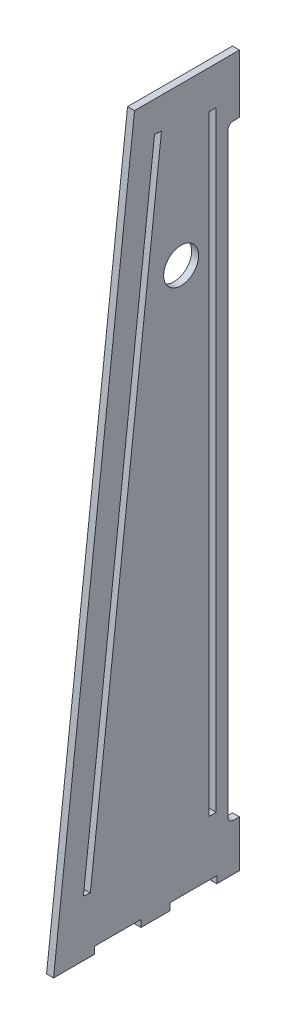
ISO-10303-21;
HEADER;
FILE_DESCRIPTION(('STEP AP214'),'2;1');
FILE_NAME('part.step','',(''),(''),'','','');
FILE_SCHEMA(('AUTOMOTIVE_DESIGN { 1 0 10303 214 1 1 1 1 }'));
ENDSEC;
DATA;
#1=APPLICATION_CONTEXT('core data for automotive mechanical design processes');
#2=APPLICATION_PROTOCOL_DEFINITION('international standard','automotive_design',2000,#1);
#3=PRODUCT_CONTEXT('',#1,'mechanical');
#4=PRODUCT('Part','Part','',(#3));
#5=PRODUCT_RELATED_PRODUCT_CATEGORY('part','',(#4));
#6=PRODUCT_DEFINITION_FORMATION('','',#4);
#7=PRODUCT_DEFINITION_CONTEXT('part definition',#1,'design');
#8=PRODUCT_DEFINITION('design','',#6,#7);
#9=PRODUCT_DEFINITION_SHAPE('','',#8);
#10=(LENGTH_UNIT() NAMED_UNIT(*) SI_UNIT(.MILLI.,.METRE.));
#11=(NAMED_UNIT(*) PLANE_ANGLE_UNIT() SI_UNIT($,.RADIAN.));
#12=(NAMED_UNIT(*) SI_UNIT($,.STERADIAN.) SOLID_ANGLE_UNIT());
#13=UNCERTAINTY_MEASURE_WITH_UNIT(LENGTH_MEASURE(1.E-05),#10,'distance_accuracy_value','');
#14=(GEOMETRIC_REPRESENTATION_CONTEXT(3) GLOBAL_UNCERTAINTY_ASSIGNED_CONTEXT((#13)) GLOBAL_UNIT_ASSIGNED_CONTEXT((#10,
#11,#12)) REPRESENTATION_CONTEXT('',''));
#15=CARTESIAN_POINT('',(0.,0.,0.));
#16=DIRECTION('',(0.,0.,1.));
#17=DIRECTION('',(1.,0.,0.));
#18=AXIS2_PLACEMENT_3D('',#15,#16,#17);
#19=CARTESIAN_POINT('',(6.,-120.811435327329,-108.496690815774));
#20=DIRECTION('',(1.,0.,0.));
#21=DIRECTION('',(0.,0.,-1.));
#22=AXIS2_PLACEMENT_3D('',#19,#20,#21);
#23=PLANE('',#22);
#24=DIRECTION('',(0.,1.,0.));
#25=VECTOR('',#24,1.);
#26=CARTESIAN_POINT('',(6.,-112.44968813367,-93.4966908157744));
#27=LINE('',#26,#25);
#28=CARTESIAN_POINT('',(6.,-112.44968813367,-93.4966908157744));
#29=VERTEX_POINT('',#28);
#30=CARTESIAN_POINT('',(6.,411.003346382378,-93.4966908157744));
#31=VERTEX_POINT('',#30);
#32=EDGE_CURVE('E222',#29,#31,#27,.T.);
#33=ORIENTED_EDGE('',*,*,#32,.F.);
#34=DIRECTION('',(0.,0.,-1.));
#35=VECTOR('',#34,1.);
#36=CARTESIAN_POINT('',(6.,-112.44968813367,-87.4966908157744));
#37=LINE('',#36,#35);
#38=CARTESIAN_POINT('',(6.,-112.44968813367,-87.4966908157744));
#39=VERTEX_POINT('',#38);
#40=EDGE_CURVE('E214',#39,#29,#37,.T.);
#41=ORIENTED_EDGE('',*,*,#40,.F.);
#42=DIRECTION('',(0.,-1.,0.));
#43=VECTOR('',#42,1.);
#44=CARTESIAN_POINT('',(6.,-112.44968813367,-87.4966908157744));
#45=LINE('',#44,#43);
#46=CARTESIAN_POINT('',(6.,411.003346382377,-87.4966908157744));
#47=VERTEX_POINT('',#46);
#48=EDGE_CURVE('E237',#47,#39,#45,.T.);
#49=ORIENTED_EDGE('',*,*,#48,.F.);
#50=DIRECTION('',(0.,0.,1.));
#51=VECTOR('',#50,1.);
#52=CARTESIAN_POINT('',(6.,411.003346382378,-87.4966908157744));
#53=LINE('',#52,#51);
#54=EDGE_CURVE('E235',#31,#47,#53,.T.);
#55=ORIENTED_EDGE('',*,*,#54,.F.);
#56=EDGE_LOOP('',(#33,#41,#49,#55));
#57=FACE_BOUND('',#56,.T.);
#58=DIRECTION('',(0.,-0.113203213767908,-0.993571855676587));
#59=VECTOR('',#58,1.);
#60=CARTESIAN_POINT('',(6.,-117.761455379899,20.3544576567378));
#61=LINE('',#60,#59);
#62=CARTESIAN_POINT('',(6.,-117.761455379899,20.3544576567378));
#63=VERTEX_POINT('',#62);
#64=CARTESIAN_POINT('',(6.,-118.440674662507,14.3930265226783));
#65=VERTEX_POINT('',#64);
#66=EDGE_CURVE('E255',#63,#65,#61,.T.);
#67=ORIENTED_EDGE('',*,*,#66,.F.);
#68=DIRECTION('',(0.,-0.993571855676587,0.113203213767907));
#69=VECTOR('',#68,1.);
#70=CARTESIAN_POINT('',(6.,417.66779870415,-40.6500001098247));
#71=LINE('',#70,#69);
#72=CARTESIAN_POINT('',(6.,417.66779870415,-40.6500001098247));
#73=VERTEX_POINT('',#72);
#74=EDGE_CURVE('E253',#73,#63,#71,.T.);
#75=ORIENTED_EDGE('',*,*,#74,.F.);
#76=DIRECTION('',(0.,0.113203213767889,0.993571855676589));
#77=VECTOR('',#76,1.);
#78=CARTESIAN_POINT('',(6.,416.988579421543,-46.6114312438842));
#79=LINE('',#78,#77);
#80=CARTESIAN_POINT('',(6.,416.988579421543,-46.6114312438842));
#81=VERTEX_POINT('',#80);
#82=EDGE_CURVE('E261',#81,#73,#79,.T.);
#83=ORIENTED_EDGE('',*,*,#82,.F.);
#84=DIRECTION('',(0.,0.993571855676587,-0.113203213767907));
#85=VECTOR('',#84,1.);
#86=CARTESIAN_POINT('',(6.,-118.440674662507,14.3930265226783));
#87=LINE('',#86,#85);
#88=EDGE_CURVE('E258',#65,#81,#87,.T.);
#89=ORIENTED_EDGE('',*,*,#88,.F.);
#90=EDGE_LOOP('',(#67,#75,#83,#89));
#91=FACE_BOUND('',#90,.T.);
#92=DIRECTION('',(0.,-0.993571855676588,0.113203213767907));
#93=VECTOR('',#92,1.);
#94=CARTESIAN_POINT('',(6.,443.788564672671,-23.4966908157744));
#95=LINE('',#94,#93);
#96=CARTESIAN_POINT('',(6.,443.788564672671,-23.4966908157744));
#97=VERTEX_POINT('',#96);
#98=CARTESIAN_POINT('',(6.,-165.811435327329,45.9584560049087));
#99=VERTEX_POINT('',#98);
#100=EDGE_CURVE('E284',#97,#99,#95,.T.);
#101=ORIENTED_EDGE('',*,*,#100,.T.);
#102=DIRECTION('',(0.,0.,-1.));
#103=VECTOR('',#102,1.);
#104=CARTESIAN_POINT('',(6.,-165.811435327329,45.9584560049087));
#105=LINE('',#104,#103);
#106=CARTESIAN_POINT('',(6.,-165.811435327329,10.9584560049088));
#107=VERTEX_POINT('',#106);
#108=EDGE_CURVE('E287',#99,#107,#105,.T.);
#109=ORIENTED_EDGE('',*,*,#108,.T.);
#110=DIRECTION('',(0.,1.,0.));
#111=VECTOR('',#110,1.);
#112=CARTESIAN_POINT('',(6.,-165.811435327329,10.9584560049088));
#113=LINE('',#112,#111);
#114=CARTESIAN_POINT('',(6.,-159.811435327329,10.9584560049088));
#115=VERTEX_POINT('',#114);
#116=EDGE_CURVE('E290',#107,#115,#113,.T.);
#117=ORIENTED_EDGE('',*,*,#116,.T.);
#118=DIRECTION('',(0.,0.,-1.));
#119=VECTOR('',#118,1.);
#120=CARTESIAN_POINT('',(6.,-159.811435327329,10.9584560049088));
#121=LINE('',#120,#119);
#122=CARTESIAN_POINT('',(6.,-159.811435327329,-29.0415439950912));
#123=VERTEX_POINT('',#122);
#124=EDGE_CURVE('E292',#115,#123,#121,.T.);
#125=ORIENTED_EDGE('',*,*,#124,.T.);
#126=DIRECTION('',(0.,-1.,0.));
#127=VECTOR('',#126,1.);
#128=CARTESIAN_POINT('',(6.,-159.811435327329,-29.0415439950912));
#129=LINE('',#128,#127);
#130=CARTESIAN_POINT('',(6.,-165.811435327329,-29.0415439950912));
#131=VERTEX_POINT('',#130);
#132=EDGE_CURVE('E294',#123,#131,#129,.T.);
#133=ORIENTED_EDGE('',*,*,#132,.T.);
#134=DIRECTION('',(0.,0.,-1.));
#135=VECTOR('',#134,1.);
#136=CARTESIAN_POINT('',(6.,-165.811435327329,-29.0415439950912));
#137=LINE('',#136,#135);
#138=CARTESIAN_POINT('',(6.,-165.811435327329,-54.0415439950912));
#139=VERTEX_POINT('',#138);
#140=EDGE_CURVE('E296',#131,#139,#137,.T.);
#141=ORIENTED_EDGE('',*,*,#140,.T.);
#142=DIRECTION('',(0.,1.,0.));
#143=VECTOR('',#142,1.);
#144=CARTESIAN_POINT('',(6.,-165.811435327329,-54.0415439950912));
#145=LINE('',#144,#143);
#146=CARTESIAN_POINT('',(6.,-159.811435327329,-54.0415439950912));
#147=VERTEX_POINT('',#146);
#148=EDGE_CURVE('E298',#139,#147,#145,.T.);
#149=ORIENTED_EDGE('',*,*,#148,.T.);
#150=DIRECTION('',(0.,0.,-1.));
#151=VECTOR('',#150,1.);
#152=CARTESIAN_POINT('',(6.,-159.811435327329,-54.0415439950912));
#153=LINE('',#152,#151);
#154=CARTESIAN_POINT('',(6.,-159.811435327329,-94.0415439950912));
#155=VERTEX_POINT('',#154);
#156=EDGE_CURVE('E300',#147,#155,#153,.T.);
#157=ORIENTED_EDGE('',*,*,#156,.T.);
#158=DIRECTION('',(0.,-1.,0.));
#159=VECTOR('',#158,1.);
#160=CARTESIAN_POINT('',(6.,-159.811435327329,-94.0415439950912));
#161=LINE('',#160,#159);
#162=CARTESIAN_POINT('',(6.,-165.811435327329,-94.0415439950912));
#163=VERTEX_POINT('',#162);
#164=EDGE_CURVE('E302',#155,#163,#161,.T.);
#165=ORIENTED_EDGE('',*,*,#164,.T.);
#166=DIRECTION('',(0.,0.,-1.));
#167=VECTOR('',#166,1.);
#168=CARTESIAN_POINT('',(6.,-165.811435327329,-94.0415439950912));
#169=LINE('',#168,#167);
#170=CARTESIAN_POINT('',(6.,-165.811435327329,-113.496690815775));
#171=VERTEX_POINT('',#170);
#172=EDGE_CURVE('E304',#163,#171,#169,.T.);
#173=ORIENTED_EDGE('',*,*,#172,.T.);
#174=DIRECTION('',(0.,1.,0.));
#175=VECTOR('',#174,1.);
#176=CARTESIAN_POINT('',(6.,-165.811435327329,-113.496690815775));
#177=LINE('',#176,#175);
#178=CARTESIAN_POINT('',(6.,-125.811435327329,-113.496690815774));
#179=VERTEX_POINT('',#178);
#180=EDGE_CURVE('E306',#171,#179,#177,.T.);
#181=ORIENTED_EDGE('',*,*,#180,.T.);
#182=DIRECTION('',(0.,0.,1.));
#183=VECTOR('',#182,1.);
#184=CARTESIAN_POINT('',(6.,-125.811435327329,-113.496690815774));
#185=LINE('',#184,#183);
#186=CARTESIAN_POINT('',(6.,-125.811435327329,-108.496690815774));
#187=VERTEX_POINT('',#186);
#188=EDGE_CURVE('E308',#179,#187,#185,.T.);
#189=ORIENTED_EDGE('',*,*,#188,.T.);
#190=CARTESIAN_POINT('',(6.,-120.811435327329,-108.496690815774));
#191=DIRECTION('',(-1.,0.,0.));
#192=DIRECTION('',(0.,0.,-1.));
#193=AXIS2_PLACEMENT_3D('',#190,#191,#192);
#194=CIRCLE('',#193,5.);
#195=CARTESIAN_POINT('',(6.,-120.811435327329,-103.496690815774));
#196=VERTEX_POINT('',#195);
#197=EDGE_CURVE('E310',#187,#196,#194,.T.);
#198=ORIENTED_EDGE('',*,*,#197,.T.);
#199=DIRECTION('',(0.,1.,0.));
#200=VECTOR('',#199,1.);
#201=CARTESIAN_POINT('',(6.,-120.811435327329,-103.496690815774));
#202=LINE('',#201,#200);
#203=CARTESIAN_POINT('',(6.,388.788564672671,-103.496690815774));
#204=VERTEX_POINT('',#203);
#205=EDGE_CURVE('E312',#196,#204,#202,.T.);
#206=ORIENTED_EDGE('',*,*,#205,.T.);
#207=CARTESIAN_POINT('',(6.,388.788564672671,-108.496690815774));
#208=DIRECTION('',(-1.,0.,0.));
#209=DIRECTION('',(0.,0.,-1.));
#210=AXIS2_PLACEMENT_3D('',#207,#208,#209);
#211=CIRCLE('',#210,5.);
#212=CARTESIAN_POINT('',(6.,393.788564672671,-108.496690815774));
#213=VERTEX_POINT('',#212);
#214=EDGE_CURVE('E314',#204,#213,#211,.T.);
#215=ORIENTED_EDGE('',*,*,#214,.T.);
#216=DIRECTION('',(0.,0.,-1.));
#217=VECTOR('',#216,1.);
#218=CARTESIAN_POINT('',(6.,393.788564672671,-108.496690815774));
#219=LINE('',#218,#217);
#220=CARTESIAN_POINT('',(6.,393.788564672671,-113.496690815774));
#221=VERTEX_POINT('',#220);
#222=EDGE_CURVE('E316',#213,#221,#219,.T.);
#223=ORIENTED_EDGE('',*,*,#222,.T.);
#224=DIRECTION('',(0.,1.,0.));
#225=VECTOR('',#224,1.);
#226=CARTESIAN_POINT('',(6.,393.788564672671,-113.496690815774));
#227=LINE('',#226,#225);
#228=CARTESIAN_POINT('',(6.,443.788564672671,-113.496690815774));
#229=VERTEX_POINT('',#228);
#230=EDGE_CURVE('E318',#221,#229,#227,.T.);
#231=ORIENTED_EDGE('',*,*,#230,.T.);
#232=DIRECTION('',(0.,0.,1.));
#233=VECTOR('',#232,1.);
#234=CARTESIAN_POINT('',(6.,443.788564672671,-113.496690815774));
#235=LINE('',#234,#233);
#236=EDGE_CURVE('E320',#229,#97,#235,.T.);
#237=ORIENTED_EDGE('',*,*,#236,.T.);
#238=EDGE_LOOP('',(#101,#109,#117,#125,#133,#141,#149,#157,#165,#173,#181,#189,#198,#206,#215,
#223,#231,#237));
#239=FACE_BOUND('',#238,.T.);
#240=CARTESIAN_POINT('',(6.,308.788564672671,-63.4966908157744));
#241=DIRECTION('',(1.,0.,0.));
#242=DIRECTION('',(0.,0.,-1.));
#243=AXIS2_PLACEMENT_3D('',#240,#241,#242);
#244=CIRCLE('',#243,15.);
#245=CARTESIAN_POINT('',(6.,308.788564672671,-78.4966908157744));
#246=VERTEX_POINT('',#245);
#247=EDGE_CURVE('E243',#246,#246,#244,.T.);
#248=ORIENTED_EDGE('',*,*,#247,.F.);
#249=EDGE_LOOP('',(#248));
#250=FACE_BOUND('',#249,.T.);
#251=ADVANCED_FACE('F41',(#57,#91,#239,#250),#23,.T.);
#252=CARTESIAN_POINT('',(0.,-120.811435327329,-108.496690815774));
#253=DIRECTION('',(1.,0.,0.));
#254=DIRECTION('',(0.,0.,-1.));
#255=AXIS2_PLACEMENT_3D('',#252,#253,#254);
#256=PLANE('',#255);
#257=DIRECTION('',(0.,-0.993571855676587,0.113203213767907));
#258=VECTOR('',#257,1.);
#259=CARTESIAN_POINT('',(0.,417.66779870415,-40.6500001098247));
#260=LINE('',#259,#258);
#261=CARTESIAN_POINT('',(0.,417.66779870415,-40.6500001098246));
#262=VERTEX_POINT('',#261);
#263=CARTESIAN_POINT('',(0.,-117.761455379899,20.3544576567378));
#264=VERTEX_POINT('',#263);
#265=EDGE_CURVE('E230',#262,#264,#260,.T.);
#266=ORIENTED_EDGE('',*,*,#265,.T.);
#267=DIRECTION('',(0.,-0.113203213767908,-0.993571855676587));
#268=VECTOR('',#267,1.);
#269=CARTESIAN_POINT('',(0.,-117.761455379899,20.3544576567378));
#270=LINE('',#269,#268);
#271=CARTESIAN_POINT('',(0.,-118.440674662507,14.3930265226783));
#272=VERTEX_POINT('',#271);
#273=EDGE_CURVE('E266',#264,#272,#270,.T.);
#274=ORIENTED_EDGE('',*,*,#273,.T.);
#275=DIRECTION('',(0.,0.993571855676587,-0.113203213767907));
#276=VECTOR('',#275,1.);
#277=CARTESIAN_POINT('',(0.,-118.440674662507,14.3930265226783));
#278=LINE('',#277,#276);
#279=CARTESIAN_POINT('',(0.,416.988579421543,-46.6114312438842));
#280=VERTEX_POINT('',#279);
#281=EDGE_CURVE('E269',#272,#280,#278,.T.);
#282=ORIENTED_EDGE('',*,*,#281,.T.);
#283=DIRECTION('',(0.,0.113203213767889,0.993571855676589));
#284=VECTOR('',#283,1.);
#285=CARTESIAN_POINT('',(0.,416.988579421543,-46.6114312438842));
#286=LINE('',#285,#284);
#287=EDGE_CURVE('E256',#280,#262,#286,.T.);
#288=ORIENTED_EDGE('',*,*,#287,.T.);
#289=EDGE_LOOP('',(#266,#274,#282,#288));
#290=FACE_BOUND('',#289,.T.);
#291=DIRECTION('',(0.,-0.993571855676588,0.113203213767907));
#292=VECTOR('',#291,1.);
#293=CARTESIAN_POINT('',(0.,443.788564672671,-23.4966908157744));
#294=LINE('',#293,#292);
#295=CARTESIAN_POINT('',(0.,443.788564672671,-23.4966908157744));
#296=VERTEX_POINT('',#295);
#297=CARTESIAN_POINT('',(0.,-165.811435327329,45.9584560049087));
#298=VERTEX_POINT('',#297);
#299=EDGE_CURVE('E283',#296,#298,#294,.T.);
#300=ORIENTED_EDGE('',*,*,#299,.F.);
#301=DIRECTION('',(0.,0.,1.));
#302=VECTOR('',#301,1.);
#303=CARTESIAN_POINT('',(0.,443.788564672671,-113.496690815774));
#304=LINE('',#303,#302);
#305=CARTESIAN_POINT('',(0.,443.788564672671,-113.496690815774));
#306=VERTEX_POINT('',#305);
#307=EDGE_CURVE('E288',#306,#296,#304,.T.);
#308=ORIENTED_EDGE('',*,*,#307,.F.);
#309=DIRECTION('',(0.,1.,0.));
#310=VECTOR('',#309,1.);
#311=CARTESIAN_POINT('',(0.,393.788564672671,-113.496690815774));
#312=LINE('',#311,#310);
#313=CARTESIAN_POINT('',(0.,393.788564672671,-113.496690815774));
#314=VERTEX_POINT('',#313);
#315=EDGE_CURVE('E355',#314,#306,#312,.T.);
#316=ORIENTED_EDGE('',*,*,#315,.F.);
#317=DIRECTION('',(0.,0.,-1.));
#318=VECTOR('',#317,1.);
#319=CARTESIAN_POINT('',(0.,393.788564672671,-108.496690815774));
#320=LINE('',#319,#318);
#321=CARTESIAN_POINT('',(0.,393.788564672671,-108.496690815774));
#322=VERTEX_POINT('',#321);
#323=EDGE_CURVE('E353',#322,#314,#320,.T.);
#324=ORIENTED_EDGE('',*,*,#323,.F.);
#325=CARTESIAN_POINT('',(0.,388.788564672671,-108.496690815774));
#326=DIRECTION('',(-1.,0.,0.));
#327=DIRECTION('',(0.,0.,-1.));
#328=AXIS2_PLACEMENT_3D('',#325,#326,#327);
#329=CIRCLE('',#328,5.);
#330=CARTESIAN_POINT('',(0.,388.788564672671,-103.496690815774));
#331=VERTEX_POINT('',#330);
#332=EDGE_CURVE('E351',#331,#322,#329,.T.);
#333=ORIENTED_EDGE('',*,*,#332,.F.);
#334=DIRECTION('',(0.,1.,0.));
#335=VECTOR('',#334,1.);
#336=CARTESIAN_POINT('',(0.,-120.811435327329,-103.496690815774));
#337=LINE('',#336,#335);
#338=CARTESIAN_POINT('',(0.,-120.811435327329,-103.496690815774));
#339=VERTEX_POINT('',#338);
#340=EDGE_CURVE('E349',#339,#331,#337,.T.);
#341=ORIENTED_EDGE('',*,*,#340,.F.);
#342=CARTESIAN_POINT('',(0.,-120.811435327329,-108.496690815774));
#343=DIRECTION('',(-1.,0.,0.));
#344=DIRECTION('',(0.,0.,-1.));
#345=AXIS2_PLACEMENT_3D('',#342,#343,#344);
#346=CIRCLE('',#345,5.);
#347=CARTESIAN_POINT('',(0.,-125.811435327329,-108.496690815774));
#348=VERTEX_POINT('',#347);
#349=EDGE_CURVE('E347',#348,#339,#346,.T.);
#350=ORIENTED_EDGE('',*,*,#349,.F.);
#351=DIRECTION('',(0.,0.,1.));
#352=VECTOR('',#351,1.);
#353=CARTESIAN_POINT('',(0.,-125.811435327329,-113.496690815774));
#354=LINE('',#353,#352);
#355=CARTESIAN_POINT('',(0.,-125.811435327329,-113.496690815774));
#356=VERTEX_POINT('',#355);
#357=EDGE_CURVE('E345',#356,#348,#354,.T.);
#358=ORIENTED_EDGE('',*,*,#357,.F.);
#359=DIRECTION('',(0.,1.,0.));
#360=VECTOR('',#359,1.);
#361=CARTESIAN_POINT('',(0.,-165.811435327329,-113.496690815775));
#362=LINE('',#361,#360);
#363=CARTESIAN_POINT('',(0.,-165.811435327329,-113.496690815775));
#364=VERTEX_POINT('',#363);
#365=EDGE_CURVE('E343',#364,#356,#362,.T.);
#366=ORIENTED_EDGE('',*,*,#365,.F.);
#367=DIRECTION('',(0.,0.,-1.));
#368=VECTOR('',#367,1.);
#369=CARTESIAN_POINT('',(0.,-165.811435327329,-94.0415439950912));
#370=LINE('',#369,#368);
#371=CARTESIAN_POINT('',(0.,-165.811435327329,-94.0415439950912));
#372=VERTEX_POINT('',#371);
#373=EDGE_CURVE('E341',#372,#364,#370,.T.);
#374=ORIENTED_EDGE('',*,*,#373,.F.);
#375=DIRECTION('',(0.,-1.,0.));
#376=VECTOR('',#375,1.);
#377=CARTESIAN_POINT('',(0.,-159.811435327329,-94.0415439950912));
#378=LINE('',#377,#376);
#379=CARTESIAN_POINT('',(0.,-159.811435327329,-94.0415439950912));
#380=VERTEX_POINT('',#379);
#381=EDGE_CURVE('E339',#380,#372,#378,.T.);
#382=ORIENTED_EDGE('',*,*,#381,.F.);
#383=DIRECTION('',(0.,0.,-1.));
#384=VECTOR('',#383,1.);
#385=CARTESIAN_POINT('',(0.,-159.811435327329,-54.0415439950912));
#386=LINE('',#385,#384);
#387=CARTESIAN_POINT('',(0.,-159.811435327329,-54.0415439950912));
#388=VERTEX_POINT('',#387);
#389=EDGE_CURVE('E337',#388,#380,#386,.T.);
#390=ORIENTED_EDGE('',*,*,#389,.F.);
#391=DIRECTION('',(0.,1.,0.));
#392=VECTOR('',#391,1.);
#393=CARTESIAN_POINT('',(0.,-165.811435327329,-54.0415439950912));
#394=LINE('',#393,#392);
#395=CARTESIAN_POINT('',(0.,-165.811435327329,-54.0415439950912));
#396=VERTEX_POINT('',#395);
#397=EDGE_CURVE('E335',#396,#388,#394,.T.);
#398=ORIENTED_EDGE('',*,*,#397,.F.);
#399=DIRECTION('',(0.,0.,-1.));
#400=VECTOR('',#399,1.);
#401=CARTESIAN_POINT('',(0.,-165.811435327329,-29.0415439950912));
#402=LINE('',#401,#400);
#403=CARTESIAN_POINT('',(0.,-165.811435327329,-29.0415439950912));
#404=VERTEX_POINT('',#403);
#405=EDGE_CURVE('E333',#404,#396,#402,.T.);
#406=ORIENTED_EDGE('',*,*,#405,.F.);
#407=DIRECTION('',(0.,-1.,0.));
#408=VECTOR('',#407,1.);
#409=CARTESIAN_POINT('',(0.,-159.811435327329,-29.0415439950912));
#410=LINE('',#409,#408);
#411=CARTESIAN_POINT('',(0.,-159.811435327329,-29.0415439950912));
#412=VERTEX_POINT('',#411);
#413=EDGE_CURVE('E331',#412,#404,#410,.T.);
#414=ORIENTED_EDGE('',*,*,#413,.F.);
#415=DIRECTION('',(0.,0.,-1.));
#416=VECTOR('',#415,1.);
#417=CARTESIAN_POINT('',(0.,-159.811435327329,10.9584560049088));
#418=LINE('',#417,#416);
#419=CARTESIAN_POINT('',(0.,-159.811435327329,10.9584560049088));
#420=VERTEX_POINT('',#419);
#421=EDGE_CURVE('E329',#420,#412,#418,.T.);
#422=ORIENTED_EDGE('',*,*,#421,.F.);
#423=DIRECTION('',(0.,1.,0.));
#424=VECTOR('',#423,1.);
#425=CARTESIAN_POINT('',(0.,-165.811435327329,10.9584560049088));
#426=LINE('',#425,#424);
#427=CARTESIAN_POINT('',(0.,-165.811435327329,10.9584560049088));
#428=VERTEX_POINT('',#427);
#429=EDGE_CURVE('E327',#428,#420,#426,.T.);
#430=ORIENTED_EDGE('',*,*,#429,.F.);
#431=DIRECTION('',(0.,0.,-1.));
#432=VECTOR('',#431,1.);
#433=CARTESIAN_POINT('',(0.,-165.811435327329,45.9584560049087));
#434=LINE('',#433,#432);
#435=EDGE_CURVE('E325',#298,#428,#434,.T.);
#436=ORIENTED_EDGE('',*,*,#435,.F.);
#437=EDGE_LOOP('',(#300,#308,#316,#324,#333,#341,#350,#358,#366,#374,#382,#390,#398,#406,#414,
#422,#430,#436));
#438=FACE_BOUND('',#437,.T.);
#439=DIRECTION('',(0.,0.,-1.));
#440=VECTOR('',#439,1.);
#441=CARTESIAN_POINT('',(0.,-112.44968813367,-87.4966908157744));
#442=LINE('',#441,#440);
#443=CARTESIAN_POINT('',(0.,-112.44968813367,-87.4966908157744));
#444=VERTEX_POINT('',#443);
#445=CARTESIAN_POINT('',(0.,-112.44968813367,-93.4966908157744));
#446=VERTEX_POINT('',#445);
#447=EDGE_CURVE('E64',#444,#446,#442,.T.);
#448=ORIENTED_EDGE('',*,*,#447,.T.);
#449=DIRECTION('',(0.,1.,0.));
#450=VECTOR('',#449,1.);
#451=CARTESIAN_POINT('',(0.,-112.44968813367,-93.4966908157744));
#452=LINE('',#451,#450);
#453=CARTESIAN_POINT('',(0.,411.003346382378,-93.4966908157744));
#454=VERTEX_POINT('',#453);
#455=EDGE_CURVE('E229',#446,#454,#452,.T.);
#456=ORIENTED_EDGE('',*,*,#455,.T.);
#457=DIRECTION('',(0.,0.,1.));
#458=VECTOR('',#457,1.);
#459=CARTESIAN_POINT('',(0.,411.003346382378,-87.4966908157744));
#460=LINE('',#459,#458);
#461=CARTESIAN_POINT('',(0.,411.003346382378,-87.4966908157744));
#462=VERTEX_POINT('',#461);
#463=EDGE_CURVE('E245',#454,#462,#460,.T.);
#464=ORIENTED_EDGE('',*,*,#463,.T.);
#465=DIRECTION('',(0.,-1.,0.));
#466=VECTOR('',#465,1.);
#467=CARTESIAN_POINT('',(0.,-112.44968813367,-87.4966908157744));
#468=LINE('',#467,#466);
#469=EDGE_CURVE('E223',#462,#444,#468,.T.);
#470=ORIENTED_EDGE('',*,*,#469,.T.);
#471=EDGE_LOOP('',(#448,#456,#464,#470));
#472=FACE_BOUND('',#471,.T.);
#473=CARTESIAN_POINT('',(0.,308.788564672671,-63.4966908157744));
#474=DIRECTION('',(1.,0.,0.));
#475=DIRECTION('',(0.,0.,-1.));
#476=AXIS2_PLACEMENT_3D('',#473,#474,#475);
#477=CIRCLE('',#476,15.);
#478=CARTESIAN_POINT('',(0.,308.788564672671,-78.4966908157744));
#479=VERTEX_POINT('',#478);
#480=EDGE_CURVE('E746',#479,#479,#477,.T.);
#481=ORIENTED_EDGE('',*,*,#480,.T.);
#482=EDGE_LOOP('',(#481));
#483=FACE_BOUND('',#482,.T.);
#484=ADVANCED_FACE('F415',(#290,#438,#472,#483),#256,.F.);
#485=CARTESIAN_POINT('',(6.,443.788564672671,-23.4966908157744));
#486=DIRECTION('',(0.,-0.113203213767907,-0.993571855676587));
#487=DIRECTION('',(0.,0.993571855676587,-0.113203213767907));
#488=AXIS2_PLACEMENT_3D('',#485,#486,#487);
#489=PLANE('',#488);
#490=ORIENTED_EDGE('',*,*,#299,.T.);
#491=DIRECTION('',(-1.,0.,0.));
#492=VECTOR('',#491,1.);
#493=CARTESIAN_POINT('',(6.,-165.811435327329,45.9584560049087));
#494=LINE('',#493,#492);
#495=EDGE_CURVE('E11',#99,#298,#494,.T.);
#496=ORIENTED_EDGE('',*,*,#495,.F.);
#497=ORIENTED_EDGE('',*,*,#100,.F.);
#498=DIRECTION('',(-1.,0.,0.));
#499=VECTOR('',#498,1.);
#500=CARTESIAN_POINT('',(6.,443.788564672671,-23.4966908157744));
#501=LINE('',#500,#499);
#502=EDGE_CURVE('E322',#97,#296,#501,.T.);
#503=ORIENTED_EDGE('',*,*,#502,.T.);
#504=EDGE_LOOP('',(#490,#496,#497,#503));
#505=FACE_BOUND('',#504,.T.);
#506=ADVANCED_FACE('F43',(#505),#489,.F.);
#507=CARTESIAN_POINT('',(6.,-165.811435327329,45.9584560049087));
#508=DIRECTION('',(0.,1.,0.));
#509=DIRECTION('',(0.,0.,1.));
#510=AXIS2_PLACEMENT_3D('',#507,#508,#509);
#511=PLANE('',#510);
#512=ORIENTED_EDGE('',*,*,#435,.T.);
#513=DIRECTION('',(-1.,0.,0.));
#514=VECTOR('',#513,1.);
#515=CARTESIAN_POINT('',(6.,-165.811435327329,10.9584560049088));
#516=LINE('',#515,#514);
#517=EDGE_CURVE('E49',#107,#428,#516,.T.);
#518=ORIENTED_EDGE('',*,*,#517,.F.);
#519=ORIENTED_EDGE('',*,*,#108,.F.);
#520=ORIENTED_EDGE('',*,*,#495,.T.);
#521=EDGE_LOOP('',(#512,#518,#519,#520));
#522=FACE_BOUND('',#521,.T.);
#523=ADVANCED_FACE('F433',(#522),#511,.F.);
#524=CARTESIAN_POINT('',(6.,-165.811435327329,10.9584560049088));
#525=DIRECTION('',(0.,0.,1.));
#526=DIRECTION('',(1.,0.,0.));
#527=AXIS2_PLACEMENT_3D('',#524,#525,#526);
#528=PLANE('',#527);
#529=ORIENTED_EDGE('',*,*,#429,.T.);
#530=DIRECTION('',(-1.,0.,0.));
#531=VECTOR('',#530,1.);
#532=CARTESIAN_POINT('',(6.,-159.811435327329,10.9584560049088));
#533=LINE('',#532,#531);
#534=EDGE_CURVE('E402',#115,#420,#533,.T.);
#535=ORIENTED_EDGE('',*,*,#534,.F.);
#536=ORIENTED_EDGE('',*,*,#116,.F.);
#537=ORIENTED_EDGE('',*,*,#517,.T.);
#538=EDGE_LOOP('',(#529,#535,#536,#537));
#539=FACE_BOUND('',#538,.T.);
#540=ADVANCED_FACE('F409',(#539),#528,.F.);
#541=CARTESIAN_POINT('',(6.,-159.811435327329,10.9584560049088));
#542=DIRECTION('',(0.,1.,0.));
#543=DIRECTION('',(0.,0.,1.));
#544=AXIS2_PLACEMENT_3D('',#541,#542,#543);
#545=PLANE('',#544);
#546=ORIENTED_EDGE('',*,*,#421,.T.);
#547=DIRECTION('',(-1.,0.,0.));
#548=VECTOR('',#547,1.);
#549=CARTESIAN_POINT('',(6.,-159.811435327329,-29.0415439950912));
#550=LINE('',#549,#548);
#551=EDGE_CURVE('E399',#123,#412,#550,.T.);
#552=ORIENTED_EDGE('',*,*,#551,.F.);
#553=ORIENTED_EDGE('',*,*,#124,.F.);
#554=ORIENTED_EDGE('',*,*,#534,.T.);
#555=EDGE_LOOP('',(#546,#552,#553,#554));
#556=FACE_BOUND('',#555,.T.);
#557=ADVANCED_FACE('F421',(#556),#545,.F.);
#558=CARTESIAN_POINT('',(6.,-159.811435327329,-29.0415439950912));
#559=DIRECTION('',(0.,0.,-1.));
#560=DIRECTION('',(-1.,0.,0.));
#561=AXIS2_PLACEMENT_3D('',#558,#559,#560);
#562=PLANE('',#561);
#563=ORIENTED_EDGE('',*,*,#413,.T.);
#564=DIRECTION('',(-1.,0.,0.));
#565=VECTOR('',#564,1.);
#566=CARTESIAN_POINT('',(6.,-165.811435327329,-29.0415439950912));
#567=LINE('',#566,#565);
#568=EDGE_CURVE('E396',#131,#404,#567,.T.);
#569=ORIENTED_EDGE('',*,*,#568,.F.);
#570=ORIENTED_EDGE('',*,*,#132,.F.);
#571=ORIENTED_EDGE('',*,*,#551,.T.);
#572=EDGE_LOOP('',(#563,#569,#570,#571));
#573=FACE_BOUND('',#572,.T.);
#574=ADVANCED_FACE('F425',(#573),#562,.F.);
#575=CARTESIAN_POINT('',(6.,-165.811435327329,-29.0415439950912));
#576=DIRECTION('',(0.,1.,0.));
#577=DIRECTION('',(0.,0.,1.));
#578=AXIS2_PLACEMENT_3D('',#575,#576,#577);
#579=PLANE('',#578);
#580=ORIENTED_EDGE('',*,*,#405,.T.);
#581=DIRECTION('',(-1.,0.,0.));
#582=VECTOR('',#581,1.);
#583=CARTESIAN_POINT('',(6.,-165.811435327329,-54.0415439950912));
#584=LINE('',#583,#582);
#585=EDGE_CURVE('E393',#139,#396,#584,.T.);
#586=ORIENTED_EDGE('',*,*,#585,.F.);
#587=ORIENTED_EDGE('',*,*,#140,.F.);
#588=ORIENTED_EDGE('',*,*,#568,.T.);
#589=EDGE_LOOP('',(#580,#586,#587,#588));
#590=FACE_BOUND('',#589,.T.);
#591=ADVANCED_FACE('F496',(#590),#579,.F.);
#592=CARTESIAN_POINT('',(6.,-165.811435327329,-54.0415439950912));
#593=DIRECTION('',(0.,0.,1.));
#594=DIRECTION('',(1.,0.,0.));
#595=AXIS2_PLACEMENT_3D('',#592,#593,#594);
#596=PLANE('',#595);
#597=ORIENTED_EDGE('',*,*,#397,.T.);
#598=DIRECTION('',(-1.,0.,0.));
#599=VECTOR('',#598,1.);
#600=CARTESIAN_POINT('',(6.,-159.811435327329,-54.0415439950912));
#601=LINE('',#600,#599);
#602=EDGE_CURVE('E390',#147,#388,#601,.T.);
#603=ORIENTED_EDGE('',*,*,#602,.F.);
#604=ORIENTED_EDGE('',*,*,#148,.F.);
#605=ORIENTED_EDGE('',*,*,#585,.T.);
#606=EDGE_LOOP('',(#597,#603,#604,#605));
#607=FACE_BOUND('',#606,.T.);
#608=ADVANCED_FACE('F494',(#607),#596,.F.);
#609=CARTESIAN_POINT('',(6.,-159.811435327329,-54.0415439950912));
#610=DIRECTION('',(0.,1.,0.));
#611=DIRECTION('',(0.,0.,1.));
#612=AXIS2_PLACEMENT_3D('',#609,#610,#611);
#613=PLANE('',#612);
#614=ORIENTED_EDGE('',*,*,#389,.T.);
#615=DIRECTION('',(-1.,0.,0.));
#616=VECTOR('',#615,1.);
#617=CARTESIAN_POINT('',(6.,-159.811435327329,-94.0415439950912));
#618=LINE('',#617,#616);
#619=EDGE_CURVE('E387',#155,#380,#618,.T.);
#620=ORIENTED_EDGE('',*,*,#619,.F.);
#621=ORIENTED_EDGE('',*,*,#156,.F.);
#622=ORIENTED_EDGE('',*,*,#602,.T.);
#623=EDGE_LOOP('',(#614,#620,#621,#622));
#624=FACE_BOUND('',#623,.T.);
#625=ADVANCED_FACE('F490',(#624),#613,.F.);
#626=CARTESIAN_POINT('',(6.,-159.811435327329,-94.0415439950912));
#627=DIRECTION('',(0.,0.,-1.));
#628=DIRECTION('',(-1.,0.,0.));
#629=AXIS2_PLACEMENT_3D('',#626,#627,#628);
#630=PLANE('',#629);
#631=ORIENTED_EDGE('',*,*,#381,.T.);
#632=DIRECTION('',(-1.,0.,0.));
#633=VECTOR('',#632,1.);
#634=CARTESIAN_POINT('',(6.,-165.811435327329,-94.0415439950912));
#635=LINE('',#634,#633);
#636=EDGE_CURVE('E384',#163,#372,#635,.T.);
#637=ORIENTED_EDGE('',*,*,#636,.F.);
#638=ORIENTED_EDGE('',*,*,#164,.F.);
#639=ORIENTED_EDGE('',*,*,#619,.T.);
#640=EDGE_LOOP('',(#631,#637,#638,#639));
#641=FACE_BOUND('',#640,.T.);
#642=ADVANCED_FACE('F485',(#641),#630,.F.);
#643=CARTESIAN_POINT('',(6.,-165.811435327329,-94.0415439950912));
#644=DIRECTION('',(0.,1.,0.));
#645=DIRECTION('',(0.,0.,1.));
#646=AXIS2_PLACEMENT_3D('',#643,#644,#645);
#647=PLANE('',#646);
#648=ORIENTED_EDGE('',*,*,#373,.T.);
#649=DIRECTION('',(-1.,0.,0.));
#650=VECTOR('',#649,1.);
#651=CARTESIAN_POINT('',(6.,-165.811435327329,-113.496690815775));
#652=LINE('',#651,#650);
#653=EDGE_CURVE('E381',#171,#364,#652,.T.);
#654=ORIENTED_EDGE('',*,*,#653,.F.);
#655=ORIENTED_EDGE('',*,*,#172,.F.);
#656=ORIENTED_EDGE('',*,*,#636,.T.);
#657=EDGE_LOOP('',(#648,#654,#655,#656));
#658=FACE_BOUND('',#657,.T.);
#659=ADVANCED_FACE('F479',(#658),#647,.F.);
#660=CARTESIAN_POINT('',(6.,-165.811435327329,-113.496690815775));
#661=DIRECTION('',(0.,0.,1.));
#662=DIRECTION('',(0.,-1.,0.));
#663=AXIS2_PLACEMENT_3D('',#660,#661,#662);
#664=PLANE('',#663);
#665=ORIENTED_EDGE('',*,*,#365,.T.);
#666=DIRECTION('',(-1.,0.,0.));
#667=VECTOR('',#666,1.);
#668=CARTESIAN_POINT('',(6.,-125.811435327329,-113.496690815774));
#669=LINE('',#668,#667);
#670=EDGE_CURVE('E378',#179,#356,#669,.T.);
#671=ORIENTED_EDGE('',*,*,#670,.F.);
#672=ORIENTED_EDGE('',*,*,#180,.F.);
#673=ORIENTED_EDGE('',*,*,#653,.T.);
#674=EDGE_LOOP('',(#665,#671,#672,#673));
#675=FACE_BOUND('',#674,.T.);
#676=ADVANCED_FACE('F475',(#675),#664,.F.);
#677=CARTESIAN_POINT('',(6.,-125.811435327329,-113.496690815774));
#678=DIRECTION('',(0.,-1.,0.));
#679=DIRECTION('',(0.,0.,-1.));
#680=AXIS2_PLACEMENT_3D('',#677,#678,#679);
#681=PLANE('',#680);
#682=ORIENTED_EDGE('',*,*,#357,.T.);
#683=DIRECTION('',(-1.,0.,0.));
#684=VECTOR('',#683,1.);
#685=CARTESIAN_POINT('',(6.,-125.811435327329,-108.496690815774));
#686=LINE('',#685,#684);
#687=EDGE_CURVE('E375',#187,#348,#686,.T.);
#688=ORIENTED_EDGE('',*,*,#687,.F.);
#689=ORIENTED_EDGE('',*,*,#188,.F.);
#690=ORIENTED_EDGE('',*,*,#670,.T.);
#691=EDGE_LOOP('',(#682,#688,#689,#690));
#692=FACE_BOUND('',#691,.T.);
#693=ADVANCED_FACE('F470',(#692),#681,.F.);
#694=CARTESIAN_POINT('',(6.,-120.811435327329,-108.496690815774));
#695=DIRECTION('',(-1.,0.,0.));
#696=DIRECTION('',(0.,0.,1.));
#697=AXIS2_PLACEMENT_3D('',#694,#695,#696);
#698=CYLINDRICAL_SURFACE('',#697,5.);
#699=ORIENTED_EDGE('',*,*,#349,.T.);
#700=DIRECTION('',(-1.,0.,0.));
#701=VECTOR('',#700,1.);
#702=CARTESIAN_POINT('',(6.,-120.811435327329,-103.496690815774));
#703=LINE('',#702,#701);
#704=EDGE_CURVE('E372',#196,#339,#703,.T.);
#705=ORIENTED_EDGE('',*,*,#704,.F.);
#706=ORIENTED_EDGE('',*,*,#197,.F.);
#707=ORIENTED_EDGE('',*,*,#687,.T.);
#708=EDGE_LOOP('',(#699,#705,#706,#707));
#709=FACE_BOUND('',#708,.T.);
#710=ADVANCED_FACE('F464',(#709),#698,.F.);
#711=CARTESIAN_POINT('',(6.,-120.811435327329,-103.496690815774));
#712=DIRECTION('',(0.,0.,1.));
#713=DIRECTION('',(1.,0.,0.));
#714=AXIS2_PLACEMENT_3D('',#711,#712,#713);
#715=PLANE('',#714);
#716=ORIENTED_EDGE('',*,*,#340,.T.);
#717=DIRECTION('',(-1.,0.,0.));
#718=VECTOR('',#717,1.);
#719=CARTESIAN_POINT('',(6.,388.788564672671,-103.496690815774));
#720=LINE('',#719,#718);
#721=EDGE_CURVE('E369',#204,#331,#720,.T.);
#722=ORIENTED_EDGE('',*,*,#721,.F.);
#723=ORIENTED_EDGE('',*,*,#205,.F.);
#724=ORIENTED_EDGE('',*,*,#704,.T.);
#725=EDGE_LOOP('',(#716,#722,#723,#724));
#726=FACE_BOUND('',#725,.T.);
#727=ADVANCED_FACE('F460',(#726),#715,.F.);
#728=CARTESIAN_POINT('',(6.,388.788564672671,-108.496690815774));
#729=DIRECTION('',(-1.,0.,0.));
#730=DIRECTION('',(0.,0.,1.));
#731=AXIS2_PLACEMENT_3D('',#728,#729,#730);
#732=CYLINDRICAL_SURFACE('',#731,5.);
#733=ORIENTED_EDGE('',*,*,#332,.T.);
#734=DIRECTION('',(-1.,0.,0.));
#735=VECTOR('',#734,1.);
#736=CARTESIAN_POINT('',(6.,393.788564672671,-108.496690815774));
#737=LINE('',#736,#735);
#738=EDGE_CURVE('E366',#213,#322,#737,.T.);
#739=ORIENTED_EDGE('',*,*,#738,.F.);
#740=ORIENTED_EDGE('',*,*,#214,.F.);
#741=ORIENTED_EDGE('',*,*,#721,.T.);
#742=EDGE_LOOP('',(#733,#739,#740,#741));
#743=FACE_BOUND('',#742,.T.);
#744=ADVANCED_FACE('F455',(#743),#732,.F.);
#745=CARTESIAN_POINT('',(6.,393.788564672671,-108.496690815774));
#746=DIRECTION('',(0.,1.,0.));
#747=DIRECTION('',(0.,0.,1.));
#748=AXIS2_PLACEMENT_3D('',#745,#746,#747);
#749=PLANE('',#748);
#750=ORIENTED_EDGE('',*,*,#323,.T.);
#751=DIRECTION('',(-1.,0.,0.));
#752=VECTOR('',#751,1.);
#753=CARTESIAN_POINT('',(6.,393.788564672671,-113.496690815774));
#754=LINE('',#753,#752);
#755=EDGE_CURVE('E363',#221,#314,#754,.T.);
#756=ORIENTED_EDGE('',*,*,#755,.F.);
#757=ORIENTED_EDGE('',*,*,#222,.F.);
#758=ORIENTED_EDGE('',*,*,#738,.T.);
#759=EDGE_LOOP('',(#750,#756,#757,#758));
#760=FACE_BOUND('',#759,.T.);
#761=ADVANCED_FACE('F449',(#760),#749,.F.);
#762=CARTESIAN_POINT('',(6.,393.788564672671,-113.496690815774));
#763=DIRECTION('',(0.,0.,1.));
#764=DIRECTION('',(0.,-1.,0.));
#765=AXIS2_PLACEMENT_3D('',#762,#763,#764);
#766=PLANE('',#765);
#767=ORIENTED_EDGE('',*,*,#315,.T.);
#768=DIRECTION('',(-1.,0.,0.));
#769=VECTOR('',#768,1.);
#770=CARTESIAN_POINT('',(6.,443.788564672671,-113.496690815774));
#771=LINE('',#770,#769);
#772=EDGE_CURVE('E360',#229,#306,#771,.T.);
#773=ORIENTED_EDGE('',*,*,#772,.F.);
#774=ORIENTED_EDGE('',*,*,#230,.F.);
#775=ORIENTED_EDGE('',*,*,#755,.T.);
#776=EDGE_LOOP('',(#767,#773,#774,#775));
#777=FACE_BOUND('',#776,.T.);
#778=ADVANCED_FACE('F445',(#777),#766,.F.);
#779=CARTESIAN_POINT('',(6.,443.788564672671,-113.496690815774));
#780=DIRECTION('',(0.,-1.,0.));
#781=DIRECTION('',(0.,0.,-1.));
#782=AXIS2_PLACEMENT_3D('',#779,#780,#781);
#783=PLANE('',#782);
#784=ORIENTED_EDGE('',*,*,#307,.T.);
#785=ORIENTED_EDGE('',*,*,#502,.F.);
#786=ORIENTED_EDGE('',*,*,#236,.F.);
#787=ORIENTED_EDGE('',*,*,#772,.T.);
#788=EDGE_LOOP('',(#784,#785,#786,#787));
#789=FACE_BOUND('',#788,.T.);
#790=ADVANCED_FACE('F440',(#789),#783,.F.);
#791=CARTESIAN_POINT('',(6.,417.66779870415,-40.6500001098247));
#792=DIRECTION('',(0.,-0.113203213767907,-0.993571855676588));
#793=DIRECTION('',(0.,0.993571855676588,-0.113203213767907));
#794=AXIS2_PLACEMENT_3D('',#791,#792,#793);
#795=PLANE('',#794);
#796=ORIENTED_EDGE('',*,*,#265,.F.);
#797=DIRECTION('',(-1.,0.,0.));
#798=VECTOR('',#797,1.);
#799=CARTESIAN_POINT('',(6.,417.66779870415,-40.6500001098247));
#800=LINE('',#799,#798);
#801=EDGE_CURVE('E263',#73,#262,#800,.T.);
#802=ORIENTED_EDGE('',*,*,#801,.F.);
#803=ORIENTED_EDGE('',*,*,#74,.T.);
#804=DIRECTION('',(-1.,0.,0.));
#805=VECTOR('',#804,1.);
#806=CARTESIAN_POINT('',(6.,-117.761455379899,20.3544576567378));
#807=LINE('',#806,#805);
#808=EDGE_CURVE('E280',#63,#264,#807,.T.);
#809=ORIENTED_EDGE('',*,*,#808,.T.);
#810=EDGE_LOOP('',(#796,#802,#803,#809));
#811=FACE_BOUND('',#810,.T.);
#812=ADVANCED_FACE('F513',(#811),#795,.T.);
#813=CARTESIAN_POINT('',(6.,-117.761455379899,20.3544576567378));
#814=DIRECTION('',(0.,0.993571855676587,-0.113203213767908));
#815=DIRECTION('',(0.,0.113203213767908,0.993571855676587));
#816=AXIS2_PLACEMENT_3D('',#813,#814,#815);
#817=PLANE('',#816);
#818=ORIENTED_EDGE('',*,*,#273,.F.);
#819=ORIENTED_EDGE('',*,*,#808,.F.);
#820=ORIENTED_EDGE('',*,*,#66,.T.);
#821=DIRECTION('',(-1.,0.,0.));
#822=VECTOR('',#821,1.);
#823=CARTESIAN_POINT('',(6.,-118.440674662507,14.3930265226783));
#824=LINE('',#823,#822);
#825=EDGE_CURVE('E278',#65,#272,#824,.T.);
#826=ORIENTED_EDGE('',*,*,#825,.T.);
#827=EDGE_LOOP('',(#818,#819,#820,#826));
#828=FACE_BOUND('',#827,.T.);
#829=ADVANCED_FACE('F598',(#828),#817,.T.);
#830=CARTESIAN_POINT('',(6.,-118.440674662507,14.3930265226783));
#831=DIRECTION('',(0.,0.113203213767907,0.993571855676588));
#832=DIRECTION('',(0.,-0.993571855676588,0.113203213767907));
#833=AXIS2_PLACEMENT_3D('',#830,#831,#832);
#834=PLANE('',#833);
#835=ORIENTED_EDGE('',*,*,#281,.F.);
#836=ORIENTED_EDGE('',*,*,#825,.F.);
#837=ORIENTED_EDGE('',*,*,#88,.T.);
#838=DIRECTION('',(-1.,0.,0.));
#839=VECTOR('',#838,1.);
#840=CARTESIAN_POINT('',(6.,416.988579421543,-46.6114312438842));
#841=LINE('',#840,#839);
#842=EDGE_CURVE('E276',#81,#280,#841,.T.);
#843=ORIENTED_EDGE('',*,*,#842,.T.);
#844=EDGE_LOOP('',(#835,#836,#837,#843));
#845=FACE_BOUND('',#844,.T.);
#846=ADVANCED_FACE('F606',(#845),#834,.T.);
#847=CARTESIAN_POINT('',(6.,416.988579421543,-46.6114312438842));
#848=DIRECTION('',(0.,-0.99357185567659,0.113203213767889));
#849=DIRECTION('',(0.,-0.113203213767889,-0.99357185567659));
#850=AXIS2_PLACEMENT_3D('',#847,#848,#849);
#851=PLANE('',#850);
#852=ORIENTED_EDGE('',*,*,#287,.F.);
#853=ORIENTED_EDGE('',*,*,#842,.F.);
#854=ORIENTED_EDGE('',*,*,#82,.T.);
#855=ORIENTED_EDGE('',*,*,#801,.T.);
#856=EDGE_LOOP('',(#852,#853,#854,#855));
#857=FACE_BOUND('',#856,.T.);
#858=ADVANCED_FACE('F614',(#857),#851,.T.);
#859=CARTESIAN_POINT('',(6.,-112.44968813367,-87.4966908157744));
#860=DIRECTION('',(0.,1.,0.));
#861=DIRECTION('',(0.,0.,1.));
#862=AXIS2_PLACEMENT_3D('',#859,#860,#861);
#863=PLANE('',#862);
#864=ORIENTED_EDGE('',*,*,#447,.F.);
#865=DIRECTION('',(-1.,0.,0.));
#866=VECTOR('',#865,1.);
#867=CARTESIAN_POINT('',(6.,-112.44968813367,-87.4966908157744));
#868=LINE('',#867,#866);
#869=EDGE_CURVE('E218',#39,#444,#868,.T.);
#870=ORIENTED_EDGE('',*,*,#869,.F.);
#871=ORIENTED_EDGE('',*,*,#40,.T.);
#872=DIRECTION('',(-1.,0.,0.));
#873=VECTOR('',#872,1.);
#874=CARTESIAN_POINT('',(6.,-112.44968813367,-93.4966908157744));
#875=LINE('',#874,#873);
#876=EDGE_CURVE('E217',#29,#446,#875,.T.);
#877=ORIENTED_EDGE('',*,*,#876,.T.);
#878=EDGE_LOOP('',(#864,#870,#871,#877));
#879=FACE_BOUND('',#878,.T.);
#880=ADVANCED_FACE('F216',(#879),#863,.T.);
#881=CARTESIAN_POINT('',(6.,-112.44968813367,-93.4966908157744));
#882=DIRECTION('',(0.,0.,1.));
#883=DIRECTION('',(1.,0.,0.));
#884=AXIS2_PLACEMENT_3D('',#881,#882,#883);
#885=PLANE('',#884);
#886=ORIENTED_EDGE('',*,*,#455,.F.);
#887=ORIENTED_EDGE('',*,*,#876,.F.);
#888=ORIENTED_EDGE('',*,*,#32,.T.);
#889=DIRECTION('',(-1.,0.,0.));
#890=VECTOR('',#889,1.);
#891=CARTESIAN_POINT('',(6.,411.003346382378,-93.4966908157744));
#892=LINE('',#891,#890);
#893=EDGE_CURVE('E231',#31,#454,#892,.T.);
#894=ORIENTED_EDGE('',*,*,#893,.T.);
#895=EDGE_LOOP('',(#886,#887,#888,#894));
#896=FACE_BOUND('',#895,.T.);
#897=ADVANCED_FACE('F226',(#896),#885,.T.);
#898=CARTESIAN_POINT('',(6.,411.003346382378,-87.4966908157744));
#899=DIRECTION('',(0.,-1.,0.));
#900=DIRECTION('',(0.,0.,-1.));
#901=AXIS2_PLACEMENT_3D('',#898,#899,#900);
#902=PLANE('',#901);
#903=ORIENTED_EDGE('',*,*,#463,.F.);
#904=ORIENTED_EDGE('',*,*,#893,.F.);
#905=ORIENTED_EDGE('',*,*,#54,.T.);
#906=DIRECTION('',(-1.,0.,0.));
#907=VECTOR('',#906,1.);
#908=CARTESIAN_POINT('',(6.,411.003346382378,-87.4966908157744));
#909=LINE('',#908,#907);
#910=EDGE_CURVE('E56',#47,#462,#909,.T.);
#911=ORIENTED_EDGE('',*,*,#910,.T.);
#912=EDGE_LOOP('',(#903,#904,#905,#911));
#913=FACE_BOUND('',#912,.T.);
#914=ADVANCED_FACE('F638',(#913),#902,.T.);
#915=CARTESIAN_POINT('',(6.,-112.44968813367,-87.4966908157744));
#916=DIRECTION('',(0.,0.,-1.));
#917=DIRECTION('',(-1.,0.,0.));
#918=AXIS2_PLACEMENT_3D('',#915,#916,#917);
#919=PLANE('',#918);
#920=ORIENTED_EDGE('',*,*,#469,.F.);
#921=ORIENTED_EDGE('',*,*,#910,.F.);
#922=ORIENTED_EDGE('',*,*,#48,.T.);
#923=ORIENTED_EDGE('',*,*,#869,.T.);
#924=EDGE_LOOP('',(#920,#921,#922,#923));
#925=FACE_BOUND('',#924,.T.);
#926=ADVANCED_FACE('F646',(#925),#919,.T.);
#927=CARTESIAN_POINT('',(6.,308.788564672671,-63.4966908157744));
#928=DIRECTION('',(-1.,0.,0.));
#929=DIRECTION('',(0.,0.,1.));
#930=AXIS2_PLACEMENT_3D('',#927,#928,#929);
#931=CYLINDRICAL_SURFACE('',#930,15.);
#932=ORIENTED_EDGE('',*,*,#247,.T.);
#933=EDGE_LOOP('',(#932));
#934=FACE_BOUND('',#933,.T.);
#935=ORIENTED_EDGE('',*,*,#480,.F.);
#936=EDGE_LOOP('',(#935));
#937=FACE_BOUND('',#936,.T.);
#938=ADVANCED_FACE('F655',(#934,#937),#931,.F.);
#939=CLOSED_SHELL('',(#251,#484,#506,#523,#540,#557,#574,#591,#608,#625,#642,#659,#676,#693,
#710,#727,#744,#761,#778,#790,#812,#829,#846,#858,#880,#897,#914,#926,#938));
#940=MANIFOLD_SOLID_BREP('B2',#939);
#941=ADVANCED_BREP_SHAPE_REPRESENTATION('',(#18,#940),#14);
#942=SHAPE_DEFINITION_REPRESENTATION(#9,#941);
ENDSEC;
END-ISO-10303-21;
